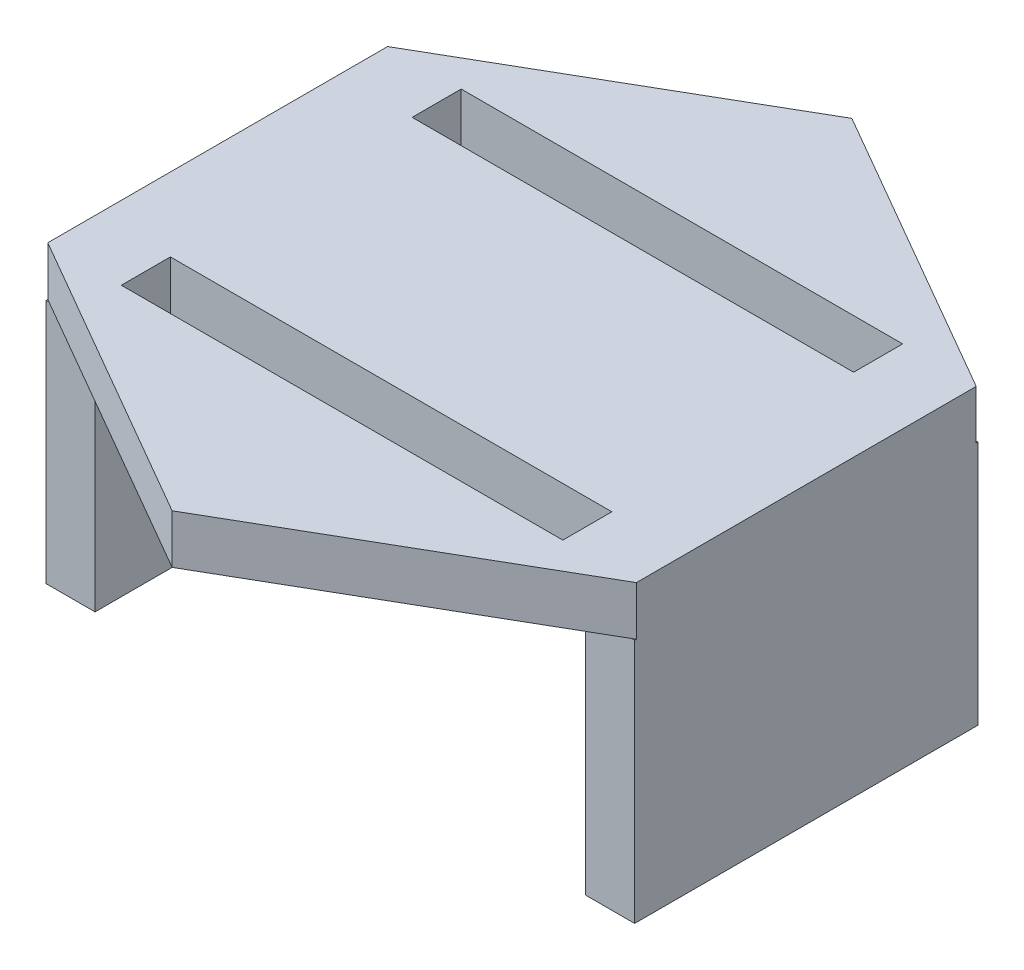
ISO-10303-21;
HEADER;
FILE_DESCRIPTION(('STEP AP214'),'2;1');
FILE_NAME('part.step','',(''),(''),'','','');
FILE_SCHEMA(('AUTOMOTIVE_DESIGN { 1 0 10303 214 1 1 1 1 }'));
ENDSEC;
DATA;
#1=APPLICATION_CONTEXT('core data for automotive mechanical design processes');
#2=APPLICATION_PROTOCOL_DEFINITION('international standard','automotive_design',2000,#1);
#3=PRODUCT_CONTEXT('',#1,'mechanical');
#4=PRODUCT('Part','Part','',(#3));
#5=PRODUCT_RELATED_PRODUCT_CATEGORY('part','',(#4));
#6=PRODUCT_DEFINITION_FORMATION('','',#4);
#7=PRODUCT_DEFINITION_CONTEXT('part definition',#1,'design');
#8=PRODUCT_DEFINITION('design','',#6,#7);
#9=PRODUCT_DEFINITION_SHAPE('','',#8);
#10=(LENGTH_UNIT() NAMED_UNIT(*) SI_UNIT(.MILLI.,.METRE.));
#11=(NAMED_UNIT(*) PLANE_ANGLE_UNIT() SI_UNIT($,.RADIAN.));
#12=(NAMED_UNIT(*) SI_UNIT($,.STERADIAN.) SOLID_ANGLE_UNIT());
#13=UNCERTAINTY_MEASURE_WITH_UNIT(LENGTH_MEASURE(1.E-05),#10,'distance_accuracy_value','');
#14=(GEOMETRIC_REPRESENTATION_CONTEXT(3) GLOBAL_UNCERTAINTY_ASSIGNED_CONTEXT((#13)) GLOBAL_UNIT_ASSIGNED_CONTEXT((#10,
#11,#12)) REPRESENTATION_CONTEXT('',''));
#15=CARTESIAN_POINT('',(0.,0.,0.));
#16=DIRECTION('',(0.,0.,1.));
#17=DIRECTION('',(1.,0.,0.));
#18=AXIS2_PLACEMENT_3D('',#15,#16,#17);
#19=CARTESIAN_POINT('',(0.,63.5,0.));
#20=DIRECTION('',(0.,1.,0.));
#21=DIRECTION('',(0.,0.,1.));
#22=AXIS2_PLACEMENT_3D('',#19,#20,#21);
#23=PLANE('',#22);
#24=DIRECTION('',(-1.,0.,0.));
#25=VECTOR('',#24,1.);
#26=CARTESIAN_POINT('',(0.,63.5,-13.1559094877505));
#27=LINE('',#26,#25);
#28=CARTESIAN_POINT('',(-6.35000000000002,63.5,-13.1559094877505));
#29=VERTEX_POINT('',#28);
#30=CARTESIAN_POINT('',(-120.65,63.5,-13.1559094877505));
#31=VERTEX_POINT('',#30);
#32=EDGE_CURVE('E288',#29,#31,#27,.T.);
#33=ORIENTED_EDGE('',*,*,#32,.T.);
#34=DIRECTION('',(0.,0.,1.));
#35=VECTOR('',#34,1.);
#36=CARTESIAN_POINT('',(-120.65,63.5,0.));
#37=LINE('',#36,#35);
#38=CARTESIAN_POINT('',(-120.65,63.5,-0.455909487750504));
#39=VERTEX_POINT('',#38);
#40=EDGE_CURVE('E292',#31,#39,#37,.T.);
#41=ORIENTED_EDGE('',*,*,#40,.T.);
#42=DIRECTION('',(1.,0.,0.));
#43=VECTOR('',#42,1.);
#44=CARTESIAN_POINT('',(0.,63.5,-0.455909487750504));
#45=LINE('',#44,#43);
#46=CARTESIAN_POINT('',(-6.35000000000002,63.5,-0.455909487750504));
#47=VERTEX_POINT('',#46);
#48=EDGE_CURVE('E283',#39,#47,#45,.T.);
#49=ORIENTED_EDGE('',*,*,#48,.T.);
#50=DIRECTION('',(0.,0.,-1.));
#51=VECTOR('',#50,1.);
#52=CARTESIAN_POINT('',(-6.35000000000002,63.5,0.));
#53=LINE('',#52,#51);
#54=EDGE_CURVE('E208',#47,#29,#53,.T.);
#55=ORIENTED_EDGE('',*,*,#54,.T.);
#56=EDGE_LOOP('',(#33,#41,#49,#55));
#57=FACE_BOUND('',#56,.T.);
#58=DIRECTION('',(1.,0.,0.));
#59=VECTOR('',#58,1.);
#60=CARTESIAN_POINT('',(0.,63.5,-75.7440905122495));
#61=LINE('',#60,#59);
#62=CARTESIAN_POINT('',(-120.65,63.5,-75.7440905122495));
#63=VERTEX_POINT('',#62);
#64=CARTESIAN_POINT('',(-6.35000000000002,63.5,-75.7440905122495));
#65=VERTEX_POINT('',#64);
#66=EDGE_CURVE('E275',#63,#65,#61,.T.);
#67=ORIENTED_EDGE('',*,*,#66,.T.);
#68=DIRECTION('',(0.,0.,-1.));
#69=VECTOR('',#68,1.);
#70=CARTESIAN_POINT('',(-6.35,63.5,0.));
#71=LINE('',#70,#69);
#72=CARTESIAN_POINT('',(-6.35000000000002,63.5,-88.4440905122495));
#73=VERTEX_POINT('',#72);
#74=EDGE_CURVE('E279',#65,#73,#71,.T.);
#75=ORIENTED_EDGE('',*,*,#74,.T.);
#76=DIRECTION('',(-1.,0.,0.));
#77=VECTOR('',#76,1.);
#78=CARTESIAN_POINT('',(0.,63.5,-88.4440905122495));
#79=LINE('',#78,#77);
#80=CARTESIAN_POINT('',(-120.65,63.5,-88.4440905122495));
#81=VERTEX_POINT('',#80);
#82=EDGE_CURVE('E237',#73,#81,#79,.T.);
#83=ORIENTED_EDGE('',*,*,#82,.T.);
#84=DIRECTION('',(0.,0.,1.));
#85=VECTOR('',#84,1.);
#86=CARTESIAN_POINT('',(-120.65,63.5,0.));
#87=LINE('',#86,#85);
#88=EDGE_CURVE('E271',#81,#63,#87,.T.);
#89=ORIENTED_EDGE('',*,*,#88,.T.);
#90=EDGE_LOOP('',(#67,#75,#83,#89));
#91=FACE_BOUND('',#90,.T.);
#92=DIRECTION('',(-1.,0.,0.));
#93=VECTOR('',#92,1.);
#94=CARTESIAN_POINT('',(-127.,63.5,-88.9));
#95=LINE('',#94,#93);
#96=CARTESIAN_POINT('',(-127.,63.5,-88.9));
#97=VERTEX_POINT('',#96);
#98=CARTESIAN_POINT('',(-138.910341603564,63.5,-88.9));
#99=VERTEX_POINT('',#98);
#100=EDGE_CURVE('E303',#97,#99,#95,.T.);
#101=ORIENTED_EDGE('',*,*,#100,.T.);
#102=DIRECTION('',(-0.866025403784438,0.,0.5));
#103=VECTOR('',#102,1.);
#104=CARTESIAN_POINT('',(-63.5,63.5,-132.438181024499));
#105=LINE('',#104,#103);
#106=CARTESIAN_POINT('',(-63.5,63.5,-132.438181024499));
#107=VERTEX_POINT('',#106);
#108=EDGE_CURVE('E353',#107,#99,#105,.T.);
#109=ORIENTED_EDGE('',*,*,#108,.F.);
#110=DIRECTION('',(-0.866025403784439,0.,-0.5));
#111=VECTOR('',#110,1.);
#112=CARTESIAN_POINT('',(12.7,63.5,-88.4440905122495));
#113=LINE('',#112,#111);
#114=CARTESIAN_POINT('',(11.9103416035635,63.5,-88.9));
#115=VERTEX_POINT('',#114);
#116=EDGE_CURVE('E375',#115,#107,#113,.T.);
#117=ORIENTED_EDGE('',*,*,#116,.F.);
#118=DIRECTION('',(-1.,0.,0.));
#119=VECTOR('',#118,1.);
#120=CARTESIAN_POINT('',(0.,63.5,-88.9));
#121=LINE('',#120,#119);
#122=CARTESIAN_POINT('',(0.,63.5,-88.9));
#123=VERTEX_POINT('',#122);
#124=EDGE_CURVE('E421',#115,#123,#121,.T.);
#125=ORIENTED_EDGE('',*,*,#124,.T.);
#126=DIRECTION('',(0.,0.,1.));
#127=VECTOR('',#126,1.);
#128=CARTESIAN_POINT('',(0.,63.5,0.));
#129=LINE('',#128,#127);
#130=CARTESIAN_POINT('',(0.,63.5,0.));
#131=VERTEX_POINT('',#130);
#132=EDGE_CURVE('E407',#123,#131,#129,.T.);
#133=ORIENTED_EDGE('',*,*,#132,.T.);
#134=DIRECTION('',(1.,0.,0.));
#135=VECTOR('',#134,1.);
#136=CARTESIAN_POINT('',(0.,63.5,0.));
#137=LINE('',#136,#135);
#138=CARTESIAN_POINT('',(11.9103416035635,63.5,0.));
#139=VERTEX_POINT('',#138);
#140=EDGE_CURVE('E413',#131,#139,#137,.T.);
#141=ORIENTED_EDGE('',*,*,#140,.T.);
#142=DIRECTION('',(0.866025403784439,0.,-0.5));
#143=VECTOR('',#142,1.);
#144=CARTESIAN_POINT('',(-63.5,63.5,43.538181024499));
#145=LINE('',#144,#143);
#146=CARTESIAN_POINT('',(-63.5,63.5,43.538181024499));
#147=VERTEX_POINT('',#146);
#148=EDGE_CURVE('E50',#147,#139,#145,.T.);
#149=ORIENTED_EDGE('',*,*,#148,.F.);
#150=DIRECTION('',(0.866025403784439,0.,0.5));
#151=VECTOR('',#150,1.);
#152=CARTESIAN_POINT('',(-139.7,63.5,-0.455909487750503));
#153=LINE('',#152,#151);
#154=CARTESIAN_POINT('',(-138.910341603563,63.5,0.));
#155=VERTEX_POINT('',#154);
#156=EDGE_CURVE('E347',#155,#147,#153,.T.);
#157=ORIENTED_EDGE('',*,*,#156,.F.);
#158=DIRECTION('',(1.,0.,0.));
#159=VECTOR('',#158,1.);
#160=CARTESIAN_POINT('',(-127.,63.5,0.));
#161=LINE('',#160,#159);
#162=CARTESIAN_POINT('',(-127.,63.5,0.));
#163=VERTEX_POINT('',#162);
#164=EDGE_CURVE('E311',#155,#163,#161,.T.);
#165=ORIENTED_EDGE('',*,*,#164,.T.);
#166=DIRECTION('',(0.,0.,-1.));
#167=VECTOR('',#166,1.);
#168=CARTESIAN_POINT('',(-127.,63.5,0.));
#169=LINE('',#168,#167);
#170=EDGE_CURVE('E297',#163,#97,#169,.T.);
#171=ORIENTED_EDGE('',*,*,#170,.T.);
#172=EDGE_LOOP('',(#101,#109,#117,#125,#133,#141,#149,#157,#165,#171));
#173=FACE_BOUND('',#172,.T.);
#174=ADVANCED_FACE('F39',(#57,#91,#173),#23,.F.);
#175=CARTESIAN_POINT('',(0.,63.5,0.));
#176=DIRECTION('',(0.,-1.,0.));
#177=DIRECTION('',(0.,0.,-1.));
#178=AXIS2_PLACEMENT_3D('',#175,#176,#177);
#179=PLANE('',#178);
#180=CARTESIAN_POINT('',(12.7,63.5,-88.4440905122495));
#181=VERTEX_POINT('',#180);
#182=EDGE_CURVE('E376',#181,#115,#113,.T.);
#183=ORIENTED_EDGE('',*,*,#182,.F.);
#184=DIRECTION('',(0.,0.,-1.));
#185=VECTOR('',#184,1.);
#186=CARTESIAN_POINT('',(12.7,63.5,0.));
#187=LINE('',#186,#185);
#188=CARTESIAN_POINT('',(12.7,63.5,-88.9));
#189=VERTEX_POINT('',#188);
#190=EDGE_CURVE('E417',#181,#189,#187,.T.);
#191=ORIENTED_EDGE('',*,*,#190,.T.);
#192=EDGE_CURVE('E422',#189,#115,#121,.T.);
#193=ORIENTED_EDGE('',*,*,#192,.T.);
#194=EDGE_LOOP('',(#183,#191,#193));
#195=FACE_BOUND('',#194,.T.);
#196=ADVANCED_FACE('F472',(#195),#179,.F.);
#197=CARTESIAN_POINT('',(12.7,63.5,-0.455909487750511));
#198=VERTEX_POINT('',#197);
#199=EDGE_CURVE('E11',#139,#198,#145,.T.);
#200=ORIENTED_EDGE('',*,*,#199,.F.);
#201=CARTESIAN_POINT('',(12.7,63.5,0.));
#202=VERTEX_POINT('',#201);
#203=EDGE_CURVE('E411',#139,#202,#137,.T.);
#204=ORIENTED_EDGE('',*,*,#203,.T.);
#205=EDGE_CURVE('E418',#202,#198,#187,.T.);
#206=ORIENTED_EDGE('',*,*,#205,.T.);
#207=EDGE_LOOP('',(#200,#204,#206));
#208=FACE_BOUND('',#207,.T.);
#209=ADVANCED_FACE('F513',(#208),#179,.F.);
#210=CARTESIAN_POINT('',(0.,63.5,0.));
#211=DIRECTION('',(1.,0.,0.));
#212=DIRECTION('',(0.,0.,-1.));
#213=AXIS2_PLACEMENT_3D('',#210,#211,#212);
#214=PLANE('',#213);
#215=DIRECTION('',(0.,0.,1.));
#216=VECTOR('',#215,1.);
#217=CARTESIAN_POINT('',(0.,0.,0.));
#218=LINE('',#217,#216);
#219=CARTESIAN_POINT('',(0.,0.,-88.9));
#220=VERTEX_POINT('',#219);
#221=CARTESIAN_POINT('',(0.,0.,0.));
#222=VERTEX_POINT('',#221);
#223=EDGE_CURVE('E406',#220,#222,#218,.T.);
#224=ORIENTED_EDGE('',*,*,#223,.T.);
#225=DIRECTION('',(0.,-1.,0.));
#226=VECTOR('',#225,1.);
#227=CARTESIAN_POINT('',(0.,63.5,0.));
#228=LINE('',#227,#226);
#229=EDGE_CURVE('E43',#131,#222,#228,.T.);
#230=ORIENTED_EDGE('',*,*,#229,.F.);
#231=ORIENTED_EDGE('',*,*,#132,.F.);
#232=DIRECTION('',(0.,-1.,0.));
#233=VECTOR('',#232,1.);
#234=CARTESIAN_POINT('',(0.,63.5,-88.9));
#235=LINE('',#234,#233);
#236=EDGE_CURVE('E426',#123,#220,#235,.T.);
#237=ORIENTED_EDGE('',*,*,#236,.T.);
#238=EDGE_LOOP('',(#224,#230,#231,#237));
#239=FACE_BOUND('',#238,.T.);
#240=ADVANCED_FACE('F41',(#239),#214,.F.);
#241=CARTESIAN_POINT('',(0.,63.5,0.));
#242=DIRECTION('',(0.,0.,-1.));
#243=DIRECTION('',(-1.,0.,0.));
#244=AXIS2_PLACEMENT_3D('',#241,#242,#243);
#245=PLANE('',#244);
#246=DIRECTION('',(1.,0.,0.));
#247=VECTOR('',#246,1.);
#248=CARTESIAN_POINT('',(0.,0.,0.));
#249=LINE('',#248,#247);
#250=CARTESIAN_POINT('',(12.7,0.,0.));
#251=VERTEX_POINT('',#250);
#252=EDGE_CURVE('E430',#222,#251,#249,.T.);
#253=ORIENTED_EDGE('',*,*,#252,.T.);
#254=DIRECTION('',(0.,-1.,0.));
#255=VECTOR('',#254,1.);
#256=CARTESIAN_POINT('',(12.7,63.5,0.));
#257=LINE('',#256,#255);
#258=EDGE_CURVE('E444',#202,#251,#257,.T.);
#259=ORIENTED_EDGE('',*,*,#258,.F.);
#260=ORIENTED_EDGE('',*,*,#203,.F.);
#261=ORIENTED_EDGE('',*,*,#140,.F.);
#262=ORIENTED_EDGE('',*,*,#229,.T.);
#263=EDGE_LOOP('',(#253,#259,#260,#261,#262));
#264=FACE_BOUND('',#263,.T.);
#265=ADVANCED_FACE('F455',(#264),#245,.F.);
#266=CARTESIAN_POINT('',(12.7,63.5,0.));
#267=DIRECTION('',(-1.,0.,0.));
#268=DIRECTION('',(0.,0.,1.));
#269=AXIS2_PLACEMENT_3D('',#266,#267,#268);
#270=PLANE('',#269);
#271=DIRECTION('',(0.,0.,-1.));
#272=VECTOR('',#271,1.);
#273=CARTESIAN_POINT('',(12.7,0.,0.));
#274=LINE('',#273,#272);
#275=CARTESIAN_POINT('',(12.7,0.,-88.9));
#276=VERTEX_POINT('',#275);
#277=EDGE_CURVE('E433',#251,#276,#274,.T.);
#278=ORIENTED_EDGE('',*,*,#277,.T.);
#279=DIRECTION('',(0.,-1.,0.));
#280=VECTOR('',#279,1.);
#281=CARTESIAN_POINT('',(12.7,63.5,-88.9));
#282=LINE('',#281,#280);
#283=EDGE_CURVE('E441',#189,#276,#282,.T.);
#284=ORIENTED_EDGE('',*,*,#283,.F.);
#285=ORIENTED_EDGE('',*,*,#190,.F.);
#286=DIRECTION('',(0.,-1.,0.));
#287=VECTOR('',#286,1.);
#288=CARTESIAN_POINT('',(12.7,76.2,-88.4440905122495));
#289=LINE('',#288,#287);
#290=CARTESIAN_POINT('',(12.7,76.2,-88.4440905122495));
#291=VERTEX_POINT('',#290);
#292=EDGE_CURVE('E394',#291,#181,#289,.T.);
#293=ORIENTED_EDGE('',*,*,#292,.F.);
#294=DIRECTION('',(0.,0.,-1.));
#295=VECTOR('',#294,1.);
#296=CARTESIAN_POINT('',(12.7,76.2,-0.455909487750511));
#297=LINE('',#296,#295);
#298=CARTESIAN_POINT('',(12.7,76.2,-0.455909487750511));
#299=VERTEX_POINT('',#298);
#300=EDGE_CURVE('E356',#299,#291,#297,.T.);
#301=ORIENTED_EDGE('',*,*,#300,.F.);
#302=DIRECTION('',(0.,-1.,0.));
#303=VECTOR('',#302,1.);
#304=CARTESIAN_POINT('',(12.7,76.2,-0.455909487750511));
#305=LINE('',#304,#303);
#306=EDGE_CURVE('E398',#299,#198,#305,.T.);
#307=ORIENTED_EDGE('',*,*,#306,.T.);
#308=ORIENTED_EDGE('',*,*,#205,.F.);
#309=ORIENTED_EDGE('',*,*,#258,.T.);
#310=EDGE_LOOP('',(#278,#284,#285,#293,#301,#307,#308,#309));
#311=FACE_BOUND('',#310,.T.);
#312=ADVANCED_FACE('F464',(#311),#270,.F.);
#313=CARTESIAN_POINT('',(0.,63.5,-88.9));
#314=DIRECTION('',(0.,0.,1.));
#315=DIRECTION('',(1.,0.,0.));
#316=AXIS2_PLACEMENT_3D('',#313,#314,#315);
#317=PLANE('',#316);
#318=DIRECTION('',(-1.,0.,0.));
#319=VECTOR('',#318,1.);
#320=CARTESIAN_POINT('',(0.,0.,-88.9));
#321=LINE('',#320,#319);
#322=EDGE_CURVE('E412',#276,#220,#321,.T.);
#323=ORIENTED_EDGE('',*,*,#322,.T.);
#324=ORIENTED_EDGE('',*,*,#236,.F.);
#325=ORIENTED_EDGE('',*,*,#124,.F.);
#326=ORIENTED_EDGE('',*,*,#192,.F.);
#327=ORIENTED_EDGE('',*,*,#283,.T.);
#328=EDGE_LOOP('',(#323,#324,#325,#326,#327));
#329=FACE_BOUND('',#328,.T.);
#330=ADVANCED_FACE('F468',(#329),#317,.F.);
#331=CARTESIAN_POINT('',(0.,0.,0.));
#332=DIRECTION('',(0.,-1.,0.));
#333=DIRECTION('',(0.,0.,-1.));
#334=AXIS2_PLACEMENT_3D('',#331,#332,#333);
#335=PLANE('',#334);
#336=ORIENTED_EDGE('',*,*,#223,.F.);
#337=ORIENTED_EDGE('',*,*,#322,.F.);
#338=ORIENTED_EDGE('',*,*,#277,.F.);
#339=ORIENTED_EDGE('',*,*,#252,.F.);
#340=EDGE_LOOP('',(#336,#337,#338,#339));
#341=FACE_BOUND('',#340,.T.);
#342=ADVANCED_FACE('F462',(#341),#335,.T.);
#343=CARTESIAN_POINT('',(-139.7,76.2,-0.455909487750503));
#344=DIRECTION('',(0.5,0.,-0.866025403784439));
#345=DIRECTION('',(-0.866025403784439,0.,-0.5));
#346=AXIS2_PLACEMENT_3D('',#343,#344,#345);
#347=PLANE('',#346);
#348=CARTESIAN_POINT('',(-139.7,63.5,-0.455909487750503));
#349=VERTEX_POINT('',#348);
#350=EDGE_CURVE('E369',#349,#155,#153,.T.);
#351=ORIENTED_EDGE('',*,*,#350,.T.);
#352=ORIENTED_EDGE('',*,*,#156,.T.);
#353=DIRECTION('',(0.,-1.,0.));
#354=VECTOR('',#353,1.);
#355=CARTESIAN_POINT('',(-63.5,76.2,43.538181024499));
#356=LINE('',#355,#354);
#357=CARTESIAN_POINT('',(-63.5,76.2,43.538181024499));
#358=VERTEX_POINT('',#357);
#359=EDGE_CURVE('E402',#358,#147,#356,.T.);
#360=ORIENTED_EDGE('',*,*,#359,.F.);
#361=DIRECTION('',(0.866025403784439,0.,0.5));
#362=VECTOR('',#361,1.);
#363=CARTESIAN_POINT('',(-139.7,76.2,-0.455909487750503));
#364=LINE('',#363,#362);
#365=CARTESIAN_POINT('',(-139.7,76.2,-0.455909487750503));
#366=VERTEX_POINT('',#365);
#367=EDGE_CURVE('E348',#366,#358,#364,.T.);
#368=ORIENTED_EDGE('',*,*,#367,.F.);
#369=DIRECTION('',(0.,-1.,0.));
#370=VECTOR('',#369,1.);
#371=CARTESIAN_POINT('',(-139.7,76.2,-0.455909487750503));
#372=LINE('',#371,#370);
#373=EDGE_CURVE('E368',#366,#349,#372,.T.);
#374=ORIENTED_EDGE('',*,*,#373,.T.);
#375=EDGE_LOOP('',(#351,#352,#360,#368,#374));
#376=FACE_BOUND('',#375,.T.);
#377=ADVANCED_FACE('F517',(#376),#347,.F.);
#378=CARTESIAN_POINT('',(-63.5,76.2,43.538181024499));
#379=DIRECTION('',(-0.5,0.,-0.866025403784439));
#380=DIRECTION('',(-0.866025403784439,0.,0.5));
#381=AXIS2_PLACEMENT_3D('',#378,#379,#380);
#382=PLANE('',#381);
#383=ORIENTED_EDGE('',*,*,#148,.T.);
#384=ORIENTED_EDGE('',*,*,#199,.T.);
#385=ORIENTED_EDGE('',*,*,#306,.F.);
#386=DIRECTION('',(0.866025403784439,0.,-0.5));
#387=VECTOR('',#386,1.);
#388=CARTESIAN_POINT('',(-63.5,76.2,43.538181024499));
#389=LINE('',#388,#387);
#390=EDGE_CURVE('E352',#358,#299,#389,.T.);
#391=ORIENTED_EDGE('',*,*,#390,.F.);
#392=ORIENTED_EDGE('',*,*,#359,.T.);
#393=EDGE_LOOP('',(#383,#384,#385,#391,#392));
#394=FACE_BOUND('',#393,.T.);
#395=ADVANCED_FACE('F511',(#394),#382,.F.);
#396=CARTESIAN_POINT('',(12.7,76.2,-88.4440905122495));
#397=DIRECTION('',(-0.5,0.,0.866025403784439));
#398=DIRECTION('',(0.866025403784439,0.,0.5));
#399=AXIS2_PLACEMENT_3D('',#396,#397,#398);
#400=PLANE('',#399);
#401=ORIENTED_EDGE('',*,*,#182,.T.);
#402=ORIENTED_EDGE('',*,*,#116,.T.);
#403=DIRECTION('',(0.,-1.,0.));
#404=VECTOR('',#403,1.);
#405=CARTESIAN_POINT('',(-63.5,76.2,-132.438181024499));
#406=LINE('',#405,#404);
#407=CARTESIAN_POINT('',(-63.5,76.2,-132.438181024499));
#408=VERTEX_POINT('',#407);
#409=EDGE_CURVE('E390',#408,#107,#406,.T.);
#410=ORIENTED_EDGE('',*,*,#409,.F.);
#411=DIRECTION('',(-0.866025403784439,0.,-0.5));
#412=VECTOR('',#411,1.);
#413=CARTESIAN_POINT('',(12.7,76.2,-88.4440905122495));
#414=LINE('',#413,#412);
#415=EDGE_CURVE('E359',#291,#408,#414,.T.);
#416=ORIENTED_EDGE('',*,*,#415,.F.);
#417=ORIENTED_EDGE('',*,*,#292,.T.);
#418=EDGE_LOOP('',(#401,#402,#410,#416,#417));
#419=FACE_BOUND('',#418,.T.);
#420=ADVANCED_FACE('F478',(#419),#400,.F.);
#421=CARTESIAN_POINT('',(-63.5,76.2,-132.438181024499));
#422=DIRECTION('',(0.5,0.,0.866025403784438));
#423=DIRECTION('',(0.866025403784439,0.,-0.5));
#424=AXIS2_PLACEMENT_3D('',#421,#422,#423);
#425=PLANE('',#424);
#426=ORIENTED_EDGE('',*,*,#108,.T.);
#427=DIRECTION('',(-0.866025403784439,0.,0.5));
#428=VECTOR('',#427,1.);
#429=CARTESIAN_POINT('',(-63.5,63.5,-132.438181024499));
#430=LINE('',#429,#428);
#431=CARTESIAN_POINT('',(-139.7,63.5,-88.4440905122495));
#432=VERTEX_POINT('',#431);
#433=EDGE_CURVE('E343',#99,#432,#430,.T.);
#434=ORIENTED_EDGE('',*,*,#433,.T.);
#435=DIRECTION('',(0.,-1.,0.));
#436=VECTOR('',#435,1.);
#437=CARTESIAN_POINT('',(-139.7,76.2,-88.4440905122495));
#438=LINE('',#437,#436);
#439=CARTESIAN_POINT('',(-139.7,76.2,-88.4440905122495));
#440=VERTEX_POINT('',#439);
#441=EDGE_CURVE('E386',#440,#432,#438,.T.);
#442=ORIENTED_EDGE('',*,*,#441,.F.);
#443=DIRECTION('',(-0.866025403784438,0.,0.5));
#444=VECTOR('',#443,1.);
#445=CARTESIAN_POINT('',(-63.5,76.2,-132.438181024499));
#446=LINE('',#445,#444);
#447=EDGE_CURVE('E362',#408,#440,#446,.T.);
#448=ORIENTED_EDGE('',*,*,#447,.F.);
#449=ORIENTED_EDGE('',*,*,#409,.T.);
#450=EDGE_LOOP('',(#426,#434,#442,#448,#449));
#451=FACE_BOUND('',#450,.T.);
#452=ADVANCED_FACE('F505',(#451),#425,.F.);
#453=CARTESIAN_POINT('',(-139.7,76.2,-88.4440905122495));
#454=DIRECTION('',(1.,0.,0.));
#455=DIRECTION('',(0.,0.,-1.));
#456=AXIS2_PLACEMENT_3D('',#453,#454,#455);
#457=PLANE('',#456);
#458=ORIENTED_EDGE('',*,*,#441,.T.);
#459=DIRECTION('',(0.,0.,1.));
#460=VECTOR('',#459,1.);
#461=CARTESIAN_POINT('',(-139.7,63.5,0.));
#462=LINE('',#461,#460);
#463=CARTESIAN_POINT('',(-139.7,63.5,-88.9));
#464=VERTEX_POINT('',#463);
#465=EDGE_CURVE('E308',#464,#432,#462,.T.);
#466=ORIENTED_EDGE('',*,*,#465,.F.);
#467=DIRECTION('',(0.,-1.,0.));
#468=VECTOR('',#467,1.);
#469=CARTESIAN_POINT('',(-139.7,63.5,-88.9));
#470=LINE('',#469,#468);
#471=CARTESIAN_POINT('',(-139.7,0.,-88.9));
#472=VERTEX_POINT('',#471);
#473=EDGE_CURVE('E335',#464,#472,#470,.T.);
#474=ORIENTED_EDGE('',*,*,#473,.T.);
#475=DIRECTION('',(0.,0.,1.));
#476=VECTOR('',#475,1.);
#477=CARTESIAN_POINT('',(-139.7,0.,0.));
#478=LINE('',#477,#476);
#479=CARTESIAN_POINT('',(-139.7,0.,0.));
#480=VERTEX_POINT('',#479);
#481=EDGE_CURVE('E323',#472,#480,#478,.T.);
#482=ORIENTED_EDGE('',*,*,#481,.T.);
#483=DIRECTION('',(0.,-1.,0.));
#484=VECTOR('',#483,1.);
#485=CARTESIAN_POINT('',(-139.7,63.5,0.));
#486=LINE('',#485,#484);
#487=CARTESIAN_POINT('',(-139.7,63.5,0.));
#488=VERTEX_POINT('',#487);
#489=EDGE_CURVE('E331',#488,#480,#486,.T.);
#490=ORIENTED_EDGE('',*,*,#489,.F.);
#491=EDGE_CURVE('E307',#349,#488,#462,.T.);
#492=ORIENTED_EDGE('',*,*,#491,.F.);
#493=ORIENTED_EDGE('',*,*,#373,.F.);
#494=DIRECTION('',(0.,0.,1.));
#495=VECTOR('',#494,1.);
#496=CARTESIAN_POINT('',(-139.7,76.2,-88.4440905122495));
#497=LINE('',#496,#495);
#498=EDGE_CURVE('E365',#440,#366,#497,.T.);
#499=ORIENTED_EDGE('',*,*,#498,.F.);
#500=EDGE_LOOP('',(#458,#466,#474,#482,#490,#492,#493,#499));
#501=FACE_BOUND('',#500,.T.);
#502=ADVANCED_FACE('F499',(#501),#457,.F.);
#503=CARTESIAN_POINT('',(0.,76.2,0.));
#504=DIRECTION('',(0.,1.,0.));
#505=DIRECTION('',(0.,0.,1.));
#506=AXIS2_PLACEMENT_3D('',#503,#504,#505);
#507=PLANE('',#506);
#508=DIRECTION('',(0.,0.,1.));
#509=VECTOR('',#508,1.);
#510=CARTESIAN_POINT('',(-120.65,76.2,-0.455909487750504));
#511=LINE('',#510,#509);
#512=CARTESIAN_POINT('',(-120.65,76.2,-13.1559094877505));
#513=VERTEX_POINT('',#512);
#514=CARTESIAN_POINT('',(-120.65,76.2,-0.455909487750504));
#515=VERTEX_POINT('',#514);
#516=EDGE_CURVE('E222',#513,#515,#511,.T.);
#517=ORIENTED_EDGE('',*,*,#516,.F.);
#518=DIRECTION('',(-1.,0.,0.));
#519=VECTOR('',#518,1.);
#520=CARTESIAN_POINT('',(-120.65,76.2,-13.1559094877505));
#521=LINE('',#520,#519);
#522=CARTESIAN_POINT('',(-6.35000000000002,76.2,-13.1559094877505));
#523=VERTEX_POINT('',#522);
#524=EDGE_CURVE('E227',#523,#513,#521,.T.);
#525=ORIENTED_EDGE('',*,*,#524,.F.);
#526=DIRECTION('',(0.,0.,-1.));
#527=VECTOR('',#526,1.);
#528=CARTESIAN_POINT('',(-6.35000000000002,76.2,-0.455909487750504));
#529=LINE('',#528,#527);
#530=CARTESIAN_POINT('',(-6.35000000000002,76.2,-0.455909487750504));
#531=VERTEX_POINT('',#530);
#532=EDGE_CURVE('E205',#531,#523,#529,.T.);
#533=ORIENTED_EDGE('',*,*,#532,.F.);
#534=DIRECTION('',(1.,0.,0.));
#535=VECTOR('',#534,1.);
#536=CARTESIAN_POINT('',(-120.65,76.2,-0.455909487750504));
#537=LINE('',#536,#535);
#538=EDGE_CURVE('E216',#515,#531,#537,.T.);
#539=ORIENTED_EDGE('',*,*,#538,.F.);
#540=EDGE_LOOP('',(#517,#525,#533,#539));
#541=FACE_BOUND('',#540,.T.);
#542=DIRECTION('',(0.,0.,-1.));
#543=VECTOR('',#542,1.);
#544=CARTESIAN_POINT('',(-6.35000000000002,76.2,-88.4440905122495));
#545=LINE('',#544,#543);
#546=CARTESIAN_POINT('',(-6.35000000000002,76.2,-75.7440905122495));
#547=VERTEX_POINT('',#546);
#548=CARTESIAN_POINT('',(-6.35000000000002,76.2,-88.4440905122495));
#549=VERTEX_POINT('',#548);
#550=EDGE_CURVE('E242',#547,#549,#545,.T.);
#551=ORIENTED_EDGE('',*,*,#550,.F.);
#552=DIRECTION('',(1.,0.,0.));
#553=VECTOR('',#552,1.);
#554=CARTESIAN_POINT('',(-6.35000000000002,76.2,-75.7440905122495));
#555=LINE('',#554,#553);
#556=CARTESIAN_POINT('',(-120.65,76.2,-75.7440905122495));
#557=VERTEX_POINT('',#556);
#558=EDGE_CURVE('E252',#557,#547,#555,.T.);
#559=ORIENTED_EDGE('',*,*,#558,.F.);
#560=DIRECTION('',(0.,0.,1.));
#561=VECTOR('',#560,1.);
#562=CARTESIAN_POINT('',(-120.65,76.2,-88.4440905122495));
#563=LINE('',#562,#561);
#564=CARTESIAN_POINT('',(-120.65,76.2,-88.4440905122495));
#565=VERTEX_POINT('',#564);
#566=EDGE_CURVE('E248',#565,#557,#563,.T.);
#567=ORIENTED_EDGE('',*,*,#566,.F.);
#568=DIRECTION('',(-1.,0.,0.));
#569=VECTOR('',#568,1.);
#570=CARTESIAN_POINT('',(-6.35000000000002,76.2,-88.4440905122495));
#571=LINE('',#570,#569);
#572=EDGE_CURVE('E245',#549,#565,#571,.T.);
#573=ORIENTED_EDGE('',*,*,#572,.F.);
#574=EDGE_LOOP('',(#551,#559,#567,#573));
#575=FACE_BOUND('',#574,.T.);
#576=ORIENTED_EDGE('',*,*,#367,.T.);
#577=ORIENTED_EDGE('',*,*,#390,.T.);
#578=ORIENTED_EDGE('',*,*,#300,.T.);
#579=ORIENTED_EDGE('',*,*,#415,.T.);
#580=ORIENTED_EDGE('',*,*,#447,.T.);
#581=ORIENTED_EDGE('',*,*,#498,.T.);
#582=EDGE_LOOP('',(#576,#577,#578,#579,#580,#581));
#583=FACE_BOUND('',#582,.T.);
#584=ADVANCED_FACE('F224',(#541,#575,#583),#507,.T.);
#585=CARTESIAN_POINT('',(0.,63.5,0.));
#586=DIRECTION('',(0.,1.,0.));
#587=DIRECTION('',(0.,0.,1.));
#588=AXIS2_PLACEMENT_3D('',#585,#586,#587);
#589=PLANE('',#588);
#590=ORIENTED_EDGE('',*,*,#350,.F.);
#591=ORIENTED_EDGE('',*,*,#491,.T.);
#592=EDGE_CURVE('E312',#488,#155,#161,.T.);
#593=ORIENTED_EDGE('',*,*,#592,.T.);
#594=EDGE_LOOP('',(#590,#591,#593));
#595=FACE_BOUND('',#594,.T.);
#596=ADVANCED_FACE('F524',(#595),#589,.T.);
#597=ORIENTED_EDGE('',*,*,#433,.F.);
#598=EDGE_CURVE('E301',#99,#464,#95,.T.);
#599=ORIENTED_EDGE('',*,*,#598,.T.);
#600=ORIENTED_EDGE('',*,*,#465,.T.);
#601=EDGE_LOOP('',(#597,#599,#600));
#602=FACE_BOUND('',#601,.T.);
#603=ADVANCED_FACE('F493',(#602),#589,.T.);
#604=CARTESIAN_POINT('',(-127.,63.5,0.));
#605=DIRECTION('',(-1.,0.,0.));
#606=DIRECTION('',(0.,0.,1.));
#607=AXIS2_PLACEMENT_3D('',#604,#605,#606);
#608=PLANE('',#607);
#609=DIRECTION('',(0.,0.,-1.));
#610=VECTOR('',#609,1.);
#611=CARTESIAN_POINT('',(-127.,0.,0.));
#612=LINE('',#611,#610);
#613=CARTESIAN_POINT('',(-127.,0.,0.));
#614=VERTEX_POINT('',#613);
#615=CARTESIAN_POINT('',(-127.,0.,-88.9));
#616=VERTEX_POINT('',#615);
#617=EDGE_CURVE('E296',#614,#616,#612,.T.);
#618=ORIENTED_EDGE('',*,*,#617,.T.);
#619=DIRECTION('',(0.,-1.,0.));
#620=VECTOR('',#619,1.);
#621=CARTESIAN_POINT('',(-127.,63.5,-88.9));
#622=LINE('',#621,#620);
#623=EDGE_CURVE('E339',#97,#616,#622,.T.);
#624=ORIENTED_EDGE('',*,*,#623,.F.);
#625=ORIENTED_EDGE('',*,*,#170,.F.);
#626=DIRECTION('',(0.,-1.,0.));
#627=VECTOR('',#626,1.);
#628=CARTESIAN_POINT('',(-127.,63.5,0.));
#629=LINE('',#628,#627);
#630=EDGE_CURVE('E316',#163,#614,#629,.T.);
#631=ORIENTED_EDGE('',*,*,#630,.T.);
#632=EDGE_LOOP('',(#618,#624,#625,#631));
#633=FACE_BOUND('',#632,.T.);
#634=ADVANCED_FACE('F532',(#633),#608,.F.);
#635=CARTESIAN_POINT('',(-127.,63.5,-88.9));
#636=DIRECTION('',(0.,0.,1.));
#637=DIRECTION('',(1.,0.,0.));
#638=AXIS2_PLACEMENT_3D('',#635,#636,#637);
#639=PLANE('',#638);
#640=DIRECTION('',(-1.,0.,0.));
#641=VECTOR('',#640,1.);
#642=CARTESIAN_POINT('',(-127.,0.,-88.9));
#643=LINE('',#642,#641);
#644=EDGE_CURVE('E320',#616,#472,#643,.T.);
#645=ORIENTED_EDGE('',*,*,#644,.T.);
#646=ORIENTED_EDGE('',*,*,#473,.F.);
#647=ORIENTED_EDGE('',*,*,#598,.F.);
#648=ORIENTED_EDGE('',*,*,#100,.F.);
#649=ORIENTED_EDGE('',*,*,#623,.T.);
#650=EDGE_LOOP('',(#645,#646,#647,#648,#649));
#651=FACE_BOUND('',#650,.T.);
#652=ADVANCED_FACE('F496',(#651),#639,.F.);
#653=CARTESIAN_POINT('',(-127.,63.5,0.));
#654=DIRECTION('',(0.,0.,-1.));
#655=DIRECTION('',(-1.,0.,0.));
#656=AXIS2_PLACEMENT_3D('',#653,#654,#655);
#657=PLANE('',#656);
#658=DIRECTION('',(1.,0.,0.));
#659=VECTOR('',#658,1.);
#660=CARTESIAN_POINT('',(-127.,0.,0.));
#661=LINE('',#660,#659);
#662=EDGE_CURVE('E302',#480,#614,#661,.T.);
#663=ORIENTED_EDGE('',*,*,#662,.T.);
#664=ORIENTED_EDGE('',*,*,#630,.F.);
#665=ORIENTED_EDGE('',*,*,#164,.F.);
#666=ORIENTED_EDGE('',*,*,#592,.F.);
#667=ORIENTED_EDGE('',*,*,#489,.T.);
#668=EDGE_LOOP('',(#663,#664,#665,#666,#667));
#669=FACE_BOUND('',#668,.T.);
#670=ADVANCED_FACE('F522',(#669),#657,.F.);
#671=CARTESIAN_POINT('',(0.,0.,0.));
#672=DIRECTION('',(0.,1.,0.));
#673=DIRECTION('',(0.,0.,1.));
#674=AXIS2_PLACEMENT_3D('',#671,#672,#673);
#675=PLANE('',#674);
#676=ORIENTED_EDGE('',*,*,#617,.F.);
#677=ORIENTED_EDGE('',*,*,#662,.F.);
#678=ORIENTED_EDGE('',*,*,#481,.F.);
#679=ORIENTED_EDGE('',*,*,#644,.F.);
#680=EDGE_LOOP('',(#676,#677,#678,#679));
#681=FACE_BOUND('',#680,.T.);
#682=ADVANCED_FACE('F529',(#681),#675,.F.);
#683=CARTESIAN_POINT('',(-6.35000000000002,0.,-88.4440905122495));
#684=DIRECTION('',(1.,0.,0.));
#685=DIRECTION('',(0.,0.,-1.));
#686=AXIS2_PLACEMENT_3D('',#683,#684,#685);
#687=PLANE('',#686);
#688=DIRECTION('',(0.,1.,0.));
#689=VECTOR('',#688,1.);
#690=CARTESIAN_POINT('',(-6.35000000000002,0.,-75.7440905122495));
#691=LINE('',#690,#689);
#692=EDGE_CURVE('E257',#65,#547,#691,.T.);
#693=ORIENTED_EDGE('',*,*,#692,.T.);
#694=ORIENTED_EDGE('',*,*,#550,.T.);
#695=DIRECTION('',(0.,1.,0.));
#696=VECTOR('',#695,1.);
#697=CARTESIAN_POINT('',(-6.35000000000002,0.,-88.4440905122495));
#698=LINE('',#697,#696);
#699=EDGE_CURVE('E256',#73,#549,#698,.T.);
#700=ORIENTED_EDGE('',*,*,#699,.F.);
#701=ORIENTED_EDGE('',*,*,#74,.F.);
#702=EDGE_LOOP('',(#693,#694,#700,#701));
#703=FACE_BOUND('',#702,.T.);
#704=ADVANCED_FACE('F651',(#703),#687,.F.);
#705=CARTESIAN_POINT('',(-6.35000000000002,0.,-75.7440905122495));
#706=DIRECTION('',(0.,0.,1.));
#707=DIRECTION('',(1.,0.,0.));
#708=AXIS2_PLACEMENT_3D('',#705,#706,#707);
#709=PLANE('',#708);
#710=DIRECTION('',(0.,1.,0.));
#711=VECTOR('',#710,1.);
#712=CARTESIAN_POINT('',(-120.65,0.,-75.7440905122495));
#713=LINE('',#712,#711);
#714=EDGE_CURVE('E260',#63,#557,#713,.T.);
#715=ORIENTED_EDGE('',*,*,#714,.T.);
#716=ORIENTED_EDGE('',*,*,#558,.T.);
#717=ORIENTED_EDGE('',*,*,#692,.F.);
#718=ORIENTED_EDGE('',*,*,#66,.F.);
#719=EDGE_LOOP('',(#715,#716,#717,#718));
#720=FACE_BOUND('',#719,.T.);
#721=ADVANCED_FACE('F689',(#720),#709,.F.);
#722=CARTESIAN_POINT('',(-120.65,0.,-88.4440905122495));
#723=DIRECTION('',(-1.,0.,0.));
#724=DIRECTION('',(0.,0.,1.));
#725=AXIS2_PLACEMENT_3D('',#722,#723,#724);
#726=PLANE('',#725);
#727=DIRECTION('',(0.,1.,0.));
#728=VECTOR('',#727,1.);
#729=CARTESIAN_POINT('',(-120.65,0.,-88.4440905122495));
#730=LINE('',#729,#728);
#731=EDGE_CURVE('E65',#81,#565,#730,.T.);
#732=ORIENTED_EDGE('',*,*,#731,.T.);
#733=ORIENTED_EDGE('',*,*,#566,.T.);
#734=ORIENTED_EDGE('',*,*,#714,.F.);
#735=ORIENTED_EDGE('',*,*,#88,.F.);
#736=EDGE_LOOP('',(#732,#733,#734,#735));
#737=FACE_BOUND('',#736,.T.);
#738=ADVANCED_FACE('F698',(#737),#726,.F.);
#739=CARTESIAN_POINT('',(-6.35000000000002,0.,-88.4440905122495));
#740=DIRECTION('',(0.,0.,-1.));
#741=DIRECTION('',(-1.,0.,0.));
#742=AXIS2_PLACEMENT_3D('',#739,#740,#741);
#743=PLANE('',#742);
#744=ORIENTED_EDGE('',*,*,#699,.T.);
#745=ORIENTED_EDGE('',*,*,#572,.T.);
#746=ORIENTED_EDGE('',*,*,#731,.F.);
#747=ORIENTED_EDGE('',*,*,#82,.F.);
#748=EDGE_LOOP('',(#744,#745,#746,#747));
#749=FACE_BOUND('',#748,.T.);
#750=ADVANCED_FACE('F707',(#749),#743,.F.);
#751=CARTESIAN_POINT('',(-120.65,0.,-0.455909487750504));
#752=DIRECTION('',(-1.,0.,0.));
#753=DIRECTION('',(0.,0.,1.));
#754=AXIS2_PLACEMENT_3D('',#751,#752,#753);
#755=PLANE('',#754);
#756=DIRECTION('',(0.,1.,0.));
#757=VECTOR('',#756,1.);
#758=CARTESIAN_POINT('',(-120.65,0.,-13.1559094877505));
#759=LINE('',#758,#757);
#760=EDGE_CURVE('E234',#31,#513,#759,.T.);
#761=ORIENTED_EDGE('',*,*,#760,.T.);
#762=ORIENTED_EDGE('',*,*,#516,.T.);
#763=DIRECTION('',(0.,1.,0.));
#764=VECTOR('',#763,1.);
#765=CARTESIAN_POINT('',(-120.65,0.,-0.455909487750504));
#766=LINE('',#765,#764);
#767=EDGE_CURVE('E212',#39,#515,#766,.T.);
#768=ORIENTED_EDGE('',*,*,#767,.F.);
#769=ORIENTED_EDGE('',*,*,#40,.F.);
#770=EDGE_LOOP('',(#761,#762,#768,#769));
#771=FACE_BOUND('',#770,.T.);
#772=ADVANCED_FACE('F716',(#771),#755,.F.);
#773=CARTESIAN_POINT('',(-120.65,0.,-13.1559094877505));
#774=DIRECTION('',(0.,0.,-1.));
#775=DIRECTION('',(-1.,0.,0.));
#776=AXIS2_PLACEMENT_3D('',#773,#774,#775);
#777=PLANE('',#776);
#778=DIRECTION('',(0.,1.,0.));
#779=VECTOR('',#778,1.);
#780=CARTESIAN_POINT('',(-6.35000000000002,0.,-13.1559094877505));
#781=LINE('',#780,#779);
#782=EDGE_CURVE('E211',#29,#523,#781,.T.);
#783=ORIENTED_EDGE('',*,*,#782,.T.);
#784=ORIENTED_EDGE('',*,*,#524,.T.);
#785=ORIENTED_EDGE('',*,*,#760,.F.);
#786=ORIENTED_EDGE('',*,*,#32,.F.);
#787=EDGE_LOOP('',(#783,#784,#785,#786));
#788=FACE_BOUND('',#787,.T.);
#789=ADVANCED_FACE('F724',(#788),#777,.F.);
#790=CARTESIAN_POINT('',(-6.35000000000002,0.,-0.455909487750504));
#791=DIRECTION('',(1.,0.,0.));
#792=DIRECTION('',(0.,0.,-1.));
#793=AXIS2_PLACEMENT_3D('',#790,#791,#792);
#794=PLANE('',#793);
#795=DIRECTION('',(0.,1.,0.));
#796=VECTOR('',#795,1.);
#797=CARTESIAN_POINT('',(-6.35000000000002,0.,-0.455909487750504));
#798=LINE('',#797,#796);
#799=EDGE_CURVE('E57',#47,#531,#798,.T.);
#800=ORIENTED_EDGE('',*,*,#799,.T.);
#801=ORIENTED_EDGE('',*,*,#532,.T.);
#802=ORIENTED_EDGE('',*,*,#782,.F.);
#803=ORIENTED_EDGE('',*,*,#54,.F.);
#804=EDGE_LOOP('',(#800,#801,#802,#803));
#805=FACE_BOUND('',#804,.T.);
#806=ADVANCED_FACE('F202',(#805),#794,.F.);
#807=CARTESIAN_POINT('',(-120.65,0.,-0.455909487750504));
#808=DIRECTION('',(0.,0.,1.));
#809=DIRECTION('',(1.,0.,0.));
#810=AXIS2_PLACEMENT_3D('',#807,#808,#809);
#811=PLANE('',#810);
#812=ORIENTED_EDGE('',*,*,#767,.T.);
#813=ORIENTED_EDGE('',*,*,#538,.T.);
#814=ORIENTED_EDGE('',*,*,#799,.F.);
#815=ORIENTED_EDGE('',*,*,#48,.F.);
#816=EDGE_LOOP('',(#812,#813,#814,#815));
#817=FACE_BOUND('',#816,.T.);
#818=ADVANCED_FACE('F217',(#817),#811,.F.);
#819=CLOSED_SHELL('',(#174,#196,#209,#240,#265,#312,#330,#342,#377,#395,#420,#452,#502,#584,
#596,#603,#634,#652,#670,#682,#704,#721,#738,#750,#772,#789,#806,#818));
#820=MANIFOLD_SOLID_BREP('B2',#819);
#821=ADVANCED_BREP_SHAPE_REPRESENTATION('',(#18,#820),#14);
#822=SHAPE_DEFINITION_REPRESENTATION(#9,#821);
ENDSEC;
END-ISO-10303-21;
